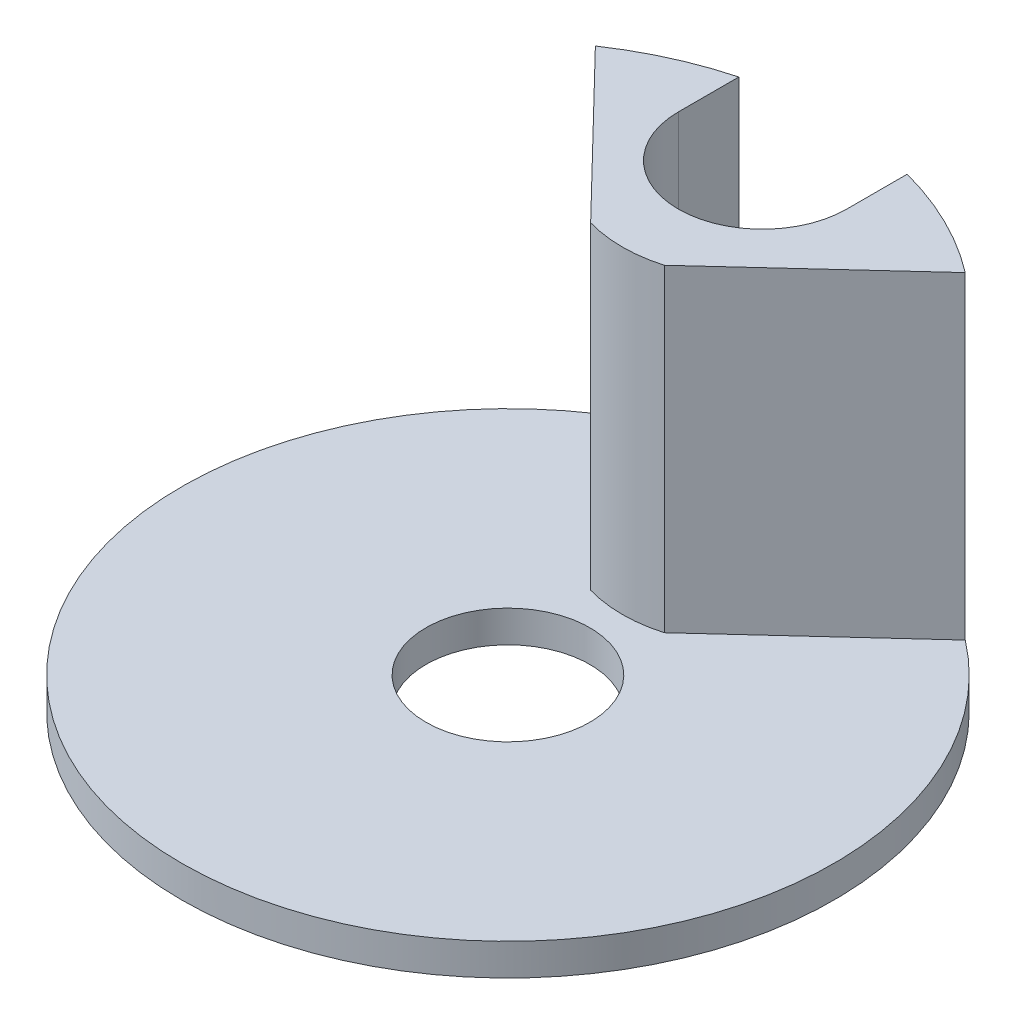
ISO-10303-21;
HEADER;
FILE_DESCRIPTION(('STEP AP214'),'2;1');
FILE_NAME('part.step','',(''),(''),'','','');
FILE_SCHEMA(('AUTOMOTIVE_DESIGN { 1 0 10303 214 1 1 1 1 }'));
ENDSEC;
DATA;
#1=APPLICATION_CONTEXT('core data for automotive mechanical design processes');
#2=APPLICATION_PROTOCOL_DEFINITION('international standard','automotive_design',2000,#1);
#3=PRODUCT_CONTEXT('',#1,'mechanical');
#4=PRODUCT('Part','Part','',(#3));
#5=PRODUCT_RELATED_PRODUCT_CATEGORY('part','',(#4));
#6=PRODUCT_DEFINITION_FORMATION('','',#4);
#7=PRODUCT_DEFINITION_CONTEXT('part definition',#1,'design');
#8=PRODUCT_DEFINITION('design','',#6,#7);
#9=PRODUCT_DEFINITION_SHAPE('','',#8);
#10=(LENGTH_UNIT() NAMED_UNIT(*) SI_UNIT(.MILLI.,.METRE.));
#11=(NAMED_UNIT(*) PLANE_ANGLE_UNIT() SI_UNIT($,.RADIAN.));
#12=(NAMED_UNIT(*) SI_UNIT($,.STERADIAN.) SOLID_ANGLE_UNIT());
#13=UNCERTAINTY_MEASURE_WITH_UNIT(LENGTH_MEASURE(1.E-05),#10,'distance_accuracy_value','');
#14=(GEOMETRIC_REPRESENTATION_CONTEXT(3) GLOBAL_UNCERTAINTY_ASSIGNED_CONTEXT((#13)) GLOBAL_UNIT_ASSIGNED_CONTEXT((#10,
#11,#12)) REPRESENTATION_CONTEXT('',''));
#15=CARTESIAN_POINT('',(0.,0.,0.));
#16=DIRECTION('',(0.,0.,1.));
#17=DIRECTION('',(1.,0.,0.));
#18=AXIS2_PLACEMENT_3D('',#15,#16,#17);
#19=CARTESIAN_POINT('',(0.,2.,0.));
#20=DIRECTION('',(0.,1.,0.));
#21=DIRECTION('',(0.,0.,1.));
#22=AXIS2_PLACEMENT_3D('',#19,#20,#21);
#23=PLANE('',#22);
#24=CARTESIAN_POINT('',(-0.000636352390258723,2.,0.021475956094353));
#25=DIRECTION('',(0.,1.,0.));
#26=DIRECTION('',(0.,0.,-1.));
#27=AXIS2_PLACEMENT_3D('',#24,#25,#26);
#28=CIRCLE('',#27,20.5174366918591);
#29=CARTESIAN_POINT('',(-5.29032268279607,2.,-19.8023588628897));
#30=VERTEX_POINT('',#29);
#31=CARTESIAN_POINT('',(-11.4846867084592,2.,-16.980929633225));
#32=VERTEX_POINT('',#31);
#33=EDGE_CURVE('E56',#30,#32,#28,.T.);
#34=ORIENTED_EDGE('',*,*,#33,.F.);
#35=DIRECTION('',(0.,0.,-1.));
#36=VECTOR('',#35,1.);
#37=CARTESIAN_POINT('',(-5.29032268279607,2.,-16.));
#38=LINE('',#37,#36);
#39=CARTESIAN_POINT('',(-5.29032268279607,2.,-16.));
#40=VERTEX_POINT('',#39);
#41=EDGE_CURVE('E60',#40,#30,#38,.T.);
#42=ORIENTED_EDGE('',*,*,#41,.F.);
#43=CARTESIAN_POINT('',(0.,2.,-16.));
#44=DIRECTION('',(0.,-1.,0.));
#45=DIRECTION('',(0.,0.,1.));
#46=AXIS2_PLACEMENT_3D('',#43,#44,#45);
#47=CIRCLE('',#46,5.29032268279607);
#48=CARTESIAN_POINT('',(5.29032268279607,2.,-16.));
#49=VERTEX_POINT('',#48);
#50=EDGE_CURVE('E235',#49,#40,#47,.T.);
#51=ORIENTED_EDGE('',*,*,#50,.F.);
#52=DIRECTION('',(0.,0.,1.));
#53=VECTOR('',#52,1.);
#54=CARTESIAN_POINT('',(5.29032268279607,2.,-16.));
#55=LINE('',#54,#53);
#56=CARTESIAN_POINT('',(5.29032268279607,2.,-19.8020192173716));
#57=VERTEX_POINT('',#56);
#58=EDGE_CURVE('E238',#57,#49,#55,.T.);
#59=ORIENTED_EDGE('',*,*,#58,.F.);
#60=CARTESIAN_POINT('',(-0.000636352390258723,2.,0.021475956094353));
#61=DIRECTION('',(0.,1.,0.));
#62=DIRECTION('',(0.,0.,-1.));
#63=AXIS2_PLACEMENT_3D('',#60,#61,#62);
#64=CIRCLE('',#63,20.5174366918591);
#65=CARTESIAN_POINT('',(12.4699759359328,2.,-16.2711308813265));
#66=VERTEX_POINT('',#65);
#67=EDGE_CURVE('E202',#66,#57,#64,.T.);
#68=ORIENTED_EDGE('',*,*,#67,.F.);
#69=CARTESIAN_POINT('',(0.,2.,0.));
#70=DIRECTION('',(0.,1.,0.));
#71=DIRECTION('',(0.,0.,1.));
#72=AXIS2_PLACEMENT_3D('',#69,#70,#71);
#73=CIRCLE('',#72,20.5);
#74=EDGE_CURVE('E11',#66,#32,#73,.T.);
#75=ORIENTED_EDGE('',*,*,#74,.T.);
#76=EDGE_LOOP('',(#34,#42,#51,#59,#68,#75));
#77=FACE_BOUND('',#76,.T.);
#78=CARTESIAN_POINT('',(0.,2.,-16.));
#79=DIRECTION('',(0.,1.,0.));
#80=DIRECTION('',(0.,0.,1.));
#81=AXIS2_PLACEMENT_3D('',#78,#79,#80);
#82=CIRCLE('',#81,2.);
#83=CARTESIAN_POINT('',(0.,2.,-14.));
#84=VERTEX_POINT('',#83);
#85=EDGE_CURVE('E130',#84,#84,#82,.T.);
#86=ORIENTED_EDGE('',*,*,#85,.F.);
#87=EDGE_LOOP('',(#86));
#88=FACE_BOUND('',#87,.T.);
#89=ADVANCED_FACE('F39',(#77,#88),#23,.T.);
#90=CARTESIAN_POINT('',(0.,2.,0.));
#91=DIRECTION('',(0.,-1.,0.));
#92=DIRECTION('',(0.,0.,-1.));
#93=AXIS2_PLACEMENT_3D('',#90,#91,#92);
#94=CYLINDRICAL_SURFACE('',#93,20.5);
#95=ORIENTED_EDGE('',*,*,#74,.F.);
#96=EDGE_CURVE('E49',#32,#66,#73,.T.);
#97=ORIENTED_EDGE('',*,*,#96,.F.);
#98=EDGE_LOOP('',(#95,#97));
#99=FACE_BOUND('',#98,.T.);
#100=CARTESIAN_POINT('',(0.,0.,0.));
#101=DIRECTION('',(0.,1.,0.));
#102=DIRECTION('',(0.,0.,1.));
#103=AXIS2_PLACEMENT_3D('',#100,#101,#102);
#104=CIRCLE('',#103,20.5);
#105=CARTESIAN_POINT('',(0.,0.,20.5));
#106=VERTEX_POINT('',#105);
#107=EDGE_CURVE('E147',#106,#106,#104,.T.);
#108=ORIENTED_EDGE('',*,*,#107,.T.);
#109=EDGE_LOOP('',(#108));
#110=FACE_BOUND('',#109,.T.);
#111=ADVANCED_FACE('F41',(#99,#110),#94,.T.);
#112=DIRECTION('',(0.736350153626485,0.,-0.676600658626824));
#113=VECTOR('',#112,1.);
#114=CARTESIAN_POINT('',(2.61354767611568,2.,-7.21448056427756));
#115=LINE('',#114,#113);
#116=CARTESIAN_POINT('',(2.61354767611567,2.,-7.21448056427756));
#117=VERTEX_POINT('',#116);
#118=EDGE_CURVE('E191',#117,#66,#115,.T.);
#119=ORIENTED_EDGE('',*,*,#118,.F.);
#120=CARTESIAN_POINT('',(0.299469004554046,2.,-15.2511396683318));
#121=DIRECTION('',(0.,1.,0.));
#122=DIRECTION('',(0.,0.,1.));
#123=AXIS2_PLACEMENT_3D('',#120,#121,#122);
#124=CIRCLE('',#123,8.36318418145592);
#125=CARTESIAN_POINT('',(-2.0146096670059,2.,-7.21448056427707));
#126=VERTEX_POINT('',#125);
#127=EDGE_CURVE('E194',#126,#117,#124,.T.);
#128=ORIENTED_EDGE('',*,*,#127,.F.);
#129=DIRECTION('',(0.696129961202647,0.,0.717915786924901));
#130=VECTOR('',#129,1.);
#131=CARTESIAN_POINT('',(-2.0146096670059,2.,-7.21448056427707));
#132=LINE('',#131,#130);
#133=EDGE_CURVE('E209',#32,#126,#132,.T.);
#134=ORIENTED_EDGE('',*,*,#133,.F.);
#135=ORIENTED_EDGE('',*,*,#96,.T.);
#136=EDGE_LOOP('',(#119,#128,#134,#135));
#137=FACE_BOUND('',#136,.T.);
#138=CARTESIAN_POINT('',(0.,2.,0.));
#139=DIRECTION('',(0.,1.,0.));
#140=DIRECTION('',(0.,0.,1.));
#141=AXIS2_PLACEMENT_3D('',#138,#139,#140);
#142=CIRCLE('',#141,5.15);
#143=CARTESIAN_POINT('',(0.,2.,5.15));
#144=VERTEX_POINT('',#143);
#145=EDGE_CURVE('E143',#144,#144,#142,.T.);
#146=ORIENTED_EDGE('',*,*,#145,.F.);
#147=EDGE_LOOP('',(#146));
#148=FACE_BOUND('',#147,.T.);
#149=ADVANCED_FACE('F174',(#137,#148),#23,.T.);
#150=CARTESIAN_POINT('',(0.,0.,0.));
#151=DIRECTION('',(0.,1.,0.));
#152=DIRECTION('',(0.,0.,1.));
#153=AXIS2_PLACEMENT_3D('',#150,#151,#152);
#154=PLANE('',#153);
#155=CARTESIAN_POINT('',(0.,0.,-16.));
#156=DIRECTION('',(0.,1.,0.));
#157=DIRECTION('',(0.,0.,1.));
#158=AXIS2_PLACEMENT_3D('',#155,#156,#157);
#159=CIRCLE('',#158,2.);
#160=CARTESIAN_POINT('',(0.,0.,-14.));
#161=VERTEX_POINT('',#160);
#162=EDGE_CURVE('E135',#161,#161,#159,.T.);
#163=ORIENTED_EDGE('',*,*,#162,.T.);
#164=EDGE_LOOP('',(#163));
#165=FACE_BOUND('',#164,.T.);
#166=CARTESIAN_POINT('',(0.,0.,0.));
#167=DIRECTION('',(0.,1.,0.));
#168=DIRECTION('',(0.,0.,1.));
#169=AXIS2_PLACEMENT_3D('',#166,#167,#168);
#170=CIRCLE('',#169,5.15);
#171=CARTESIAN_POINT('',(0.,0.,5.15));
#172=VERTEX_POINT('',#171);
#173=EDGE_CURVE('E43',#172,#172,#170,.T.);
#174=ORIENTED_EDGE('',*,*,#173,.T.);
#175=EDGE_LOOP('',(#174));
#176=FACE_BOUND('',#175,.T.);
#177=ORIENTED_EDGE('',*,*,#107,.F.);
#178=EDGE_LOOP('',(#177));
#179=FACE_BOUND('',#178,.T.);
#180=ADVANCED_FACE('F158',(#165,#176,#179),#154,.F.);
#181=CARTESIAN_POINT('',(0.,-1.,0.));
#182=DIRECTION('',(0.,1.,0.));
#183=DIRECTION('',(0.,0.,1.));
#184=AXIS2_PLACEMENT_3D('',#181,#182,#183);
#185=CYLINDRICAL_SURFACE('',#184,5.15);
#186=ORIENTED_EDGE('',*,*,#145,.T.);
#187=EDGE_LOOP('',(#186));
#188=FACE_BOUND('',#187,.T.);
#189=ORIENTED_EDGE('',*,*,#173,.F.);
#190=EDGE_LOOP('',(#189));
#191=FACE_BOUND('',#190,.T.);
#192=ADVANCED_FACE('F161',(#188,#191),#185,.F.);
#193=CARTESIAN_POINT('',(0.,0.,-16.));
#194=DIRECTION('',(0.,1.,0.));
#195=DIRECTION('',(0.,0.,1.));
#196=AXIS2_PLACEMENT_3D('',#193,#194,#195);
#197=CYLINDRICAL_SURFACE('',#196,2.);
#198=ORIENTED_EDGE('',*,*,#162,.F.);
#199=EDGE_LOOP('',(#198));
#200=FACE_BOUND('',#199,.T.);
#201=ORIENTED_EDGE('',*,*,#85,.T.);
#202=EDGE_LOOP('',(#201));
#203=FACE_BOUND('',#202,.T.);
#204=ADVANCED_FACE('F163',(#200,#203),#197,.F.);
#205=CARTESIAN_POINT('',(-0.000636352390258723,22.,0.021475956094353));
#206=DIRECTION('',(0.,-1.,0.));
#207=DIRECTION('',(0.,0.,-1.));
#208=AXIS2_PLACEMENT_3D('',#205,#206,#207);
#209=CYLINDRICAL_SURFACE('',#208,20.5174366918591);
#210=ORIENTED_EDGE('',*,*,#33,.T.);
#211=DIRECTION('',(0.,-1.,0.));
#212=VECTOR('',#211,1.);
#213=CARTESIAN_POINT('',(-11.4846867084592,22.,-16.9809296332251));
#214=LINE('',#213,#212);
#215=CARTESIAN_POINT('',(-11.4846867084592,22.,-16.9809296332251));
#216=VERTEX_POINT('',#215);
#217=EDGE_CURVE('E110',#216,#32,#214,.T.);
#218=ORIENTED_EDGE('',*,*,#217,.F.);
#219=CARTESIAN_POINT('',(-0.000636352390258723,22.,0.021475956094353));
#220=DIRECTION('',(0.,1.,0.));
#221=DIRECTION('',(0.,0.,-1.));
#222=AXIS2_PLACEMENT_3D('',#219,#220,#221);
#223=CIRCLE('',#222,20.5174366918591);
#224=CARTESIAN_POINT('',(-5.29032268279607,22.,-19.8023588628897));
#225=VERTEX_POINT('',#224);
#226=EDGE_CURVE('E117',#225,#216,#223,.T.);
#227=ORIENTED_EDGE('',*,*,#226,.F.);
#228=DIRECTION('',(0.,-1.,0.));
#229=VECTOR('',#228,1.);
#230=CARTESIAN_POINT('',(-5.29032268279607,22.,-19.8023588628897));
#231=LINE('',#230,#229);
#232=EDGE_CURVE('E230',#225,#30,#231,.T.);
#233=ORIENTED_EDGE('',*,*,#232,.T.);
#234=EDGE_LOOP('',(#210,#218,#227,#233));
#235=FACE_BOUND('',#234,.T.);
#236=ADVANCED_FACE('F128',(#235),#209,.T.);
#237=CARTESIAN_POINT('',(-2.0146096670059,22.,-7.21448056427707));
#238=DIRECTION('',(0.717915786924902,0.,-0.696129961202647));
#239=DIRECTION('',(-0.696129961202647,0.,-0.717915786924902));
#240=AXIS2_PLACEMENT_3D('',#237,#238,#239);
#241=PLANE('',#240);
#242=ORIENTED_EDGE('',*,*,#133,.T.);
#243=DIRECTION('',(0.,-1.,0.));
#244=VECTOR('',#243,1.);
#245=CARTESIAN_POINT('',(-2.0146096670059,22.,-7.21448056427707));
#246=LINE('',#245,#244);
#247=CARTESIAN_POINT('',(-2.0146096670059,22.,-7.21448056427707));
#248=VERTEX_POINT('',#247);
#249=EDGE_CURVE('E112',#248,#126,#246,.T.);
#250=ORIENTED_EDGE('',*,*,#249,.F.);
#251=DIRECTION('',(0.696129961202647,0.,0.717915786924901));
#252=VECTOR('',#251,1.);
#253=CARTESIAN_POINT('',(-2.0146096670059,22.,-7.21448056427707));
#254=LINE('',#253,#252);
#255=EDGE_CURVE('E105',#216,#248,#254,.T.);
#256=ORIENTED_EDGE('',*,*,#255,.F.);
#257=ORIENTED_EDGE('',*,*,#217,.T.);
#258=EDGE_LOOP('',(#242,#250,#256,#257));
#259=FACE_BOUND('',#258,.T.);
#260=ADVANCED_FACE('F108',(#259),#241,.F.);
#261=CARTESIAN_POINT('',(0.299469004554046,22.,-15.2511396683318));
#262=DIRECTION('',(0.,-1.,0.));
#263=DIRECTION('',(0.,0.,-1.));
#264=AXIS2_PLACEMENT_3D('',#261,#262,#263);
#265=CYLINDRICAL_SURFACE('',#264,8.36318418145592);
#266=ORIENTED_EDGE('',*,*,#127,.T.);
#267=DIRECTION('',(0.,-1.,0.));
#268=VECTOR('',#267,1.);
#269=CARTESIAN_POINT('',(2.61354767611567,22.,-7.21448056427756));
#270=LINE('',#269,#268);
#271=CARTESIAN_POINT('',(2.61354767611567,22.,-7.21448056427756));
#272=VERTEX_POINT('',#271);
#273=EDGE_CURVE('E137',#272,#117,#270,.T.);
#274=ORIENTED_EDGE('',*,*,#273,.F.);
#275=CARTESIAN_POINT('',(0.299469004554046,22.,-15.2511396683318));
#276=DIRECTION('',(0.,1.,0.));
#277=DIRECTION('',(0.,0.,1.));
#278=AXIS2_PLACEMENT_3D('',#275,#276,#277);
#279=CIRCLE('',#278,8.36318418145592);
#280=EDGE_CURVE('E116',#248,#272,#279,.T.);
#281=ORIENTED_EDGE('',*,*,#280,.F.);
#282=ORIENTED_EDGE('',*,*,#249,.T.);
#283=EDGE_LOOP('',(#266,#274,#281,#282));
#284=FACE_BOUND('',#283,.T.);
#285=ADVANCED_FACE('F206',(#284),#265,.T.);
#286=CARTESIAN_POINT('',(2.61354767611568,22.,-7.21448056427756));
#287=DIRECTION('',(-0.676600658626824,0.,-0.736350153626485));
#288=DIRECTION('',(-0.736350153626485,0.,0.676600658626824));
#289=AXIS2_PLACEMENT_3D('',#286,#287,#288);
#290=PLANE('',#289);
#291=ORIENTED_EDGE('',*,*,#118,.T.);
#292=DIRECTION('',(0.,-1.,0.));
#293=VECTOR('',#292,1.);
#294=CARTESIAN_POINT('',(12.4699759359328,22.,-16.2711308813265));
#295=LINE('',#294,#293);
#296=CARTESIAN_POINT('',(12.4699759359328,22.,-16.2711308813265));
#297=VERTEX_POINT('',#296);
#298=EDGE_CURVE('E214',#297,#66,#295,.T.);
#299=ORIENTED_EDGE('',*,*,#298,.F.);
#300=DIRECTION('',(0.736350153626485,0.,-0.676600658626824));
#301=VECTOR('',#300,1.);
#302=CARTESIAN_POINT('',(2.61354767611568,22.,-7.21448056427756));
#303=LINE('',#302,#301);
#304=EDGE_CURVE('E212',#272,#297,#303,.T.);
#305=ORIENTED_EDGE('',*,*,#304,.F.);
#306=ORIENTED_EDGE('',*,*,#273,.T.);
#307=EDGE_LOOP('',(#291,#299,#305,#306));
#308=FACE_BOUND('',#307,.T.);
#309=ADVANCED_FACE('F211',(#308),#290,.F.);
#310=CARTESIAN_POINT('',(-0.000636352390258723,22.,0.021475956094353));
#311=DIRECTION('',(0.,-1.,0.));
#312=DIRECTION('',(0.,0.,-1.));
#313=AXIS2_PLACEMENT_3D('',#310,#311,#312);
#314=CYLINDRICAL_SURFACE('',#313,20.5174366918591);
#315=ORIENTED_EDGE('',*,*,#67,.T.);
#316=DIRECTION('',(0.,-1.,0.));
#317=VECTOR('',#316,1.);
#318=CARTESIAN_POINT('',(5.29032268279607,22.,-19.8020192173716));
#319=LINE('',#318,#317);
#320=CARTESIAN_POINT('',(5.29032268279607,22.,-19.8020192173716));
#321=VERTEX_POINT('',#320);
#322=EDGE_CURVE('E216',#321,#57,#319,.T.);
#323=ORIENTED_EDGE('',*,*,#322,.F.);
#324=CARTESIAN_POINT('',(-0.000636352390258723,22.,0.021475956094353));
#325=DIRECTION('',(0.,1.,0.));
#326=DIRECTION('',(0.,0.,-1.));
#327=AXIS2_PLACEMENT_3D('',#324,#325,#326);
#328=CIRCLE('',#327,20.5174366918591);
#329=EDGE_CURVE('E257',#297,#321,#328,.T.);
#330=ORIENTED_EDGE('',*,*,#329,.F.);
#331=ORIENTED_EDGE('',*,*,#298,.T.);
#332=EDGE_LOOP('',(#315,#323,#330,#331));
#333=FACE_BOUND('',#332,.T.);
#334=ADVANCED_FACE('F266',(#333),#314,.T.);
#335=CARTESIAN_POINT('',(5.29032268279607,22.,-16.));
#336=DIRECTION('',(1.,0.,0.));
#337=DIRECTION('',(0.,0.,-1.));
#338=AXIS2_PLACEMENT_3D('',#335,#336,#337);
#339=PLANE('',#338);
#340=ORIENTED_EDGE('',*,*,#58,.T.);
#341=DIRECTION('',(0.,-1.,0.));
#342=VECTOR('',#341,1.);
#343=CARTESIAN_POINT('',(5.29032268279607,22.,-16.));
#344=LINE('',#343,#342);
#345=CARTESIAN_POINT('',(5.29032268279607,22.,-16.));
#346=VERTEX_POINT('',#345);
#347=EDGE_CURVE('E222',#346,#49,#344,.T.);
#348=ORIENTED_EDGE('',*,*,#347,.F.);
#349=DIRECTION('',(0.,0.,1.));
#350=VECTOR('',#349,1.);
#351=CARTESIAN_POINT('',(5.29032268279607,22.,-16.));
#352=LINE('',#351,#350);
#353=EDGE_CURVE('E254',#321,#346,#352,.T.);
#354=ORIENTED_EDGE('',*,*,#353,.F.);
#355=ORIENTED_EDGE('',*,*,#322,.T.);
#356=EDGE_LOOP('',(#340,#348,#354,#355));
#357=FACE_BOUND('',#356,.T.);
#358=ADVANCED_FACE('F270',(#357),#339,.F.);
#359=CARTESIAN_POINT('',(0.,22.,-16.));
#360=DIRECTION('',(0.,-1.,0.));
#361=DIRECTION('',(0.,0.,-1.));
#362=AXIS2_PLACEMENT_3D('',#359,#360,#361);
#363=CYLINDRICAL_SURFACE('',#362,5.29032268279607);
#364=ORIENTED_EDGE('',*,*,#50,.T.);
#365=DIRECTION('',(0.,-1.,0.));
#366=VECTOR('',#365,1.);
#367=CARTESIAN_POINT('',(-5.29032268279607,22.,-16.));
#368=LINE('',#367,#366);
#369=CARTESIAN_POINT('',(-5.29032268279607,22.,-16.));
#370=VERTEX_POINT('',#369);
#371=EDGE_CURVE('E226',#370,#40,#368,.T.);
#372=ORIENTED_EDGE('',*,*,#371,.F.);
#373=CARTESIAN_POINT('',(0.,22.,-16.));
#374=DIRECTION('',(0.,-1.,0.));
#375=DIRECTION('',(0.,0.,1.));
#376=AXIS2_PLACEMENT_3D('',#373,#374,#375);
#377=CIRCLE('',#376,5.29032268279607);
#378=EDGE_CURVE('E251',#346,#370,#377,.T.);
#379=ORIENTED_EDGE('',*,*,#378,.F.);
#380=ORIENTED_EDGE('',*,*,#347,.T.);
#381=EDGE_LOOP('',(#364,#372,#379,#380));
#382=FACE_BOUND('',#381,.T.);
#383=ADVANCED_FACE('F274',(#382),#363,.F.);
#384=CARTESIAN_POINT('',(-5.29032268279607,22.,-16.));
#385=DIRECTION('',(-1.,0.,0.));
#386=DIRECTION('',(0.,0.,1.));
#387=AXIS2_PLACEMENT_3D('',#384,#385,#386);
#388=PLANE('',#387);
#389=ORIENTED_EDGE('',*,*,#41,.T.);
#390=ORIENTED_EDGE('',*,*,#232,.F.);
#391=DIRECTION('',(0.,0.,-1.));
#392=VECTOR('',#391,1.);
#393=CARTESIAN_POINT('',(-5.29032268279607,22.,-16.));
#394=LINE('',#393,#392);
#395=EDGE_CURVE('E122',#370,#225,#394,.T.);
#396=ORIENTED_EDGE('',*,*,#395,.F.);
#397=ORIENTED_EDGE('',*,*,#371,.T.);
#398=EDGE_LOOP('',(#389,#390,#396,#397));
#399=FACE_BOUND('',#398,.T.);
#400=ADVANCED_FACE('F276',(#399),#388,.F.);
#401=CARTESIAN_POINT('',(-0.000636352390258723,22.,0.021475956094353));
#402=DIRECTION('',(0.,-1.,0.));
#403=DIRECTION('',(0.,0.,-1.));
#404=AXIS2_PLACEMENT_3D('',#401,#402,#403);
#405=PLANE('',#404);
#406=ORIENTED_EDGE('',*,*,#226,.T.);
#407=ORIENTED_EDGE('',*,*,#255,.T.);
#408=ORIENTED_EDGE('',*,*,#280,.T.);
#409=ORIENTED_EDGE('',*,*,#304,.T.);
#410=ORIENTED_EDGE('',*,*,#329,.T.);
#411=ORIENTED_EDGE('',*,*,#353,.T.);
#412=ORIENTED_EDGE('',*,*,#378,.T.);
#413=ORIENTED_EDGE('',*,*,#395,.T.);
#414=EDGE_LOOP('',(#406,#407,#408,#409,#410,#411,#412,#413));
#415=FACE_BOUND('',#414,.T.);
#416=ADVANCED_FACE('F120',(#415),#405,.F.);
#417=CLOSED_SHELL('',(#89,#111,#149,#180,#192,#204,#236,#260,#285,#309,#334,#358,#383,#400,#416));
#418=MANIFOLD_SOLID_BREP('B2',#417);
#419=ADVANCED_BREP_SHAPE_REPRESENTATION('',(#18,#418),#14);
#420=SHAPE_DEFINITION_REPRESENTATION(#9,#419);
ENDSEC;
END-ISO-10303-21;
